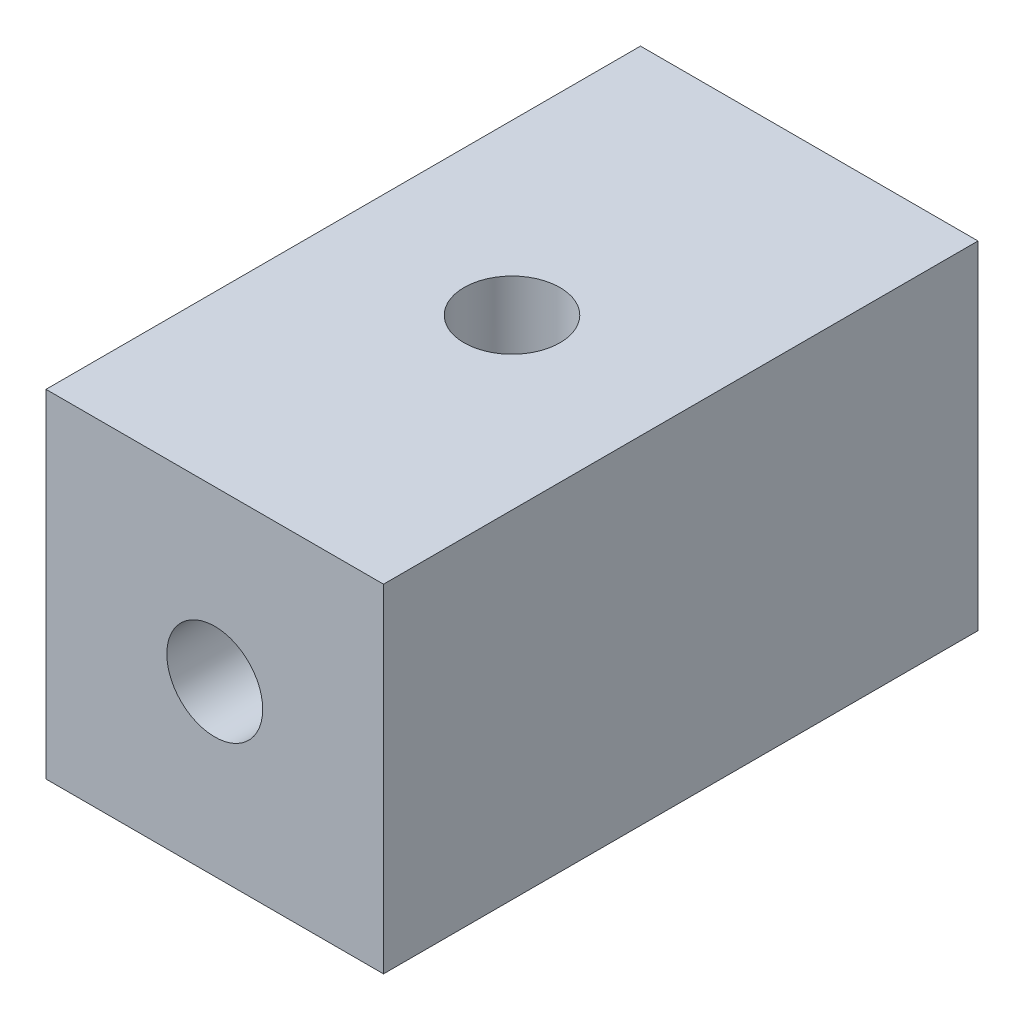
ISO-10303-21;
HEADER;
FILE_DESCRIPTION(('STEP AP214'),'2;1');
FILE_NAME('part.step','',(''),(''),'','','');
FILE_SCHEMA(('AUTOMOTIVE_DESIGN { 1 0 10303 214 1 1 1 1 }'));
ENDSEC;
DATA;
#1=APPLICATION_CONTEXT('core data for automotive mechanical design processes');
#2=APPLICATION_PROTOCOL_DEFINITION('international standard','automotive_design',2000,#1);
#3=PRODUCT_CONTEXT('',#1,'mechanical');
#4=PRODUCT('Part','Part','',(#3));
#5=PRODUCT_RELATED_PRODUCT_CATEGORY('part','',(#4));
#6=PRODUCT_DEFINITION_FORMATION('','',#4);
#7=PRODUCT_DEFINITION_CONTEXT('part definition',#1,'design');
#8=PRODUCT_DEFINITION('design','',#6,#7);
#9=PRODUCT_DEFINITION_SHAPE('','',#8);
#10=(LENGTH_UNIT() NAMED_UNIT(*) SI_UNIT(.MILLI.,.METRE.));
#11=(NAMED_UNIT(*) PLANE_ANGLE_UNIT() SI_UNIT($,.RADIAN.));
#12=(NAMED_UNIT(*) SI_UNIT($,.STERADIAN.) SOLID_ANGLE_UNIT());
#13=UNCERTAINTY_MEASURE_WITH_UNIT(LENGTH_MEASURE(1.E-05),#10,'distance_accuracy_value','');
#14=(GEOMETRIC_REPRESENTATION_CONTEXT(3) GLOBAL_UNCERTAINTY_ASSIGNED_CONTEXT((#13)) GLOBAL_UNIT_ASSIGNED_CONTEXT((#10,
#11,#12)) REPRESENTATION_CONTEXT('',''));
#15=CARTESIAN_POINT('',(0.,0.,0.));
#16=DIRECTION('',(0.,0.,1.));
#17=DIRECTION('',(1.,0.,0.));
#18=AXIS2_PLACEMENT_3D('',#15,#16,#17);
#19=CARTESIAN_POINT('',(0.,0.,39.37));
#20=DIRECTION('',(0.,0.,-1.));
#21=DIRECTION('',(-1.,0.,0.));
#22=AXIS2_PLACEMENT_3D('',#19,#20,#21);
#23=CYLINDRICAL_SURFACE('',#22,3.175);
#24=CARTESIAN_POINT('',(0.,0.,19.685));
#25=DIRECTION('',(0.,0.707106781186547,-0.707106781186547));
#26=DIRECTION('',(0.,-0.707106781186547,-0.707106781186547));
#27=AXIS2_PLACEMENT_3D('',#24,#25,#26);
#28=ELLIPSE('',#27,4.49012806053458,3.175);
#29=CARTESIAN_POINT('',(3.175,0.,19.685));
#30=VERTEX_POINT('',#29);
#31=CARTESIAN_POINT('',(-3.175,0.,19.685));
#32=VERTEX_POINT('',#31);
#33=EDGE_CURVE('E11',#30,#32,#28,.F.);
#34=ORIENTED_EDGE('',*,*,#33,.F.);
#35=CARTESIAN_POINT('',(0.,0.,19.685));
#36=DIRECTION('',(0.,-0.707106781186547,-0.707106781186547));
#37=DIRECTION('',(0.,0.707106781186547,-0.707106781186547));
#38=AXIS2_PLACEMENT_3D('',#35,#36,#37);
#39=ELLIPSE('',#38,4.49012806053458,3.175);
#40=EDGE_CURVE('E47',#32,#30,#39,.F.);
#41=ORIENTED_EDGE('',*,*,#40,.F.);
#42=EDGE_LOOP('',(#34,#41));
#43=FACE_BOUND('',#42,.T.);
#44=CARTESIAN_POINT('',(0.,0.,39.37));
#45=DIRECTION('',(0.,0.,1.));
#46=DIRECTION('',(1.,0.,0.));
#47=AXIS2_PLACEMENT_3D('',#44,#45,#46);
#48=CIRCLE('',#47,3.175);
#49=CARTESIAN_POINT('',(3.175,0.,39.37));
#50=VERTEX_POINT('',#49);
#51=EDGE_CURVE('E122',#50,#50,#48,.T.);
#52=ORIENTED_EDGE('',*,*,#51,.T.);
#53=EDGE_LOOP('',(#52));
#54=FACE_BOUND('',#53,.T.);
#55=ADVANCED_FACE('F33',(#43,#54),#23,.F.);
#56=CARTESIAN_POINT('',(0.,0.,39.37));
#57=DIRECTION('',(0.,0.,1.));
#58=DIRECTION('',(1.,0.,0.));
#59=AXIS2_PLACEMENT_3D('',#56,#57,#58);
#60=PLANE('',#59);
#61=DIRECTION('',(0.,1.,0.));
#62=VECTOR('',#61,1.);
#63=CARTESIAN_POINT('',(11.176,11.176,39.37));
#64=LINE('',#63,#62);
#65=CARTESIAN_POINT('',(11.176,-11.176,39.37));
#66=VERTEX_POINT('',#65);
#67=CARTESIAN_POINT('',(11.176,11.176,39.37));
#68=VERTEX_POINT('',#67);
#69=EDGE_CURVE('E114',#66,#68,#64,.T.);
#70=ORIENTED_EDGE('',*,*,#69,.T.);
#71=DIRECTION('',(-1.,0.,0.));
#72=VECTOR('',#71,1.);
#73=CARTESIAN_POINT('',(-11.176,11.176,39.37));
#74=LINE('',#73,#72);
#75=CARTESIAN_POINT('',(-11.176,11.176,39.37));
#76=VERTEX_POINT('',#75);
#77=EDGE_CURVE('E85',#68,#76,#74,.T.);
#78=ORIENTED_EDGE('',*,*,#77,.T.);
#79=DIRECTION('',(0.,-1.,0.));
#80=VECTOR('',#79,1.);
#81=CARTESIAN_POINT('',(-11.176,11.176,39.37));
#82=LINE('',#81,#80);
#83=CARTESIAN_POINT('',(-11.176,-11.176,39.37));
#84=VERTEX_POINT('',#83);
#85=EDGE_CURVE('E124',#76,#84,#82,.T.);
#86=ORIENTED_EDGE('',*,*,#85,.T.);
#87=DIRECTION('',(1.,0.,0.));
#88=VECTOR('',#87,1.);
#89=CARTESIAN_POINT('',(-11.176,-11.176,39.37));
#90=LINE('',#89,#88);
#91=EDGE_CURVE('E56',#84,#66,#90,.T.);
#92=ORIENTED_EDGE('',*,*,#91,.T.);
#93=EDGE_LOOP('',(#70,#78,#86,#92));
#94=FACE_BOUND('',#93,.T.);
#95=ORIENTED_EDGE('',*,*,#51,.F.);
#96=EDGE_LOOP('',(#95));
#97=FACE_BOUND('',#96,.T.);
#98=ADVANCED_FACE('F166',(#94,#97),#60,.T.);
#99=CARTESIAN_POINT('',(0.,0.,0.));
#100=DIRECTION('',(0.,0.,1.));
#101=DIRECTION('',(1.,0.,0.));
#102=AXIS2_PLACEMENT_3D('',#99,#100,#101);
#103=PLANE('',#102);
#104=DIRECTION('',(0.,1.,0.));
#105=VECTOR('',#104,1.);
#106=CARTESIAN_POINT('',(11.176,11.176,0.));
#107=LINE('',#106,#105);
#108=CARTESIAN_POINT('',(11.176,-11.176,0.));
#109=VERTEX_POINT('',#108);
#110=CARTESIAN_POINT('',(11.176,11.176,0.));
#111=VERTEX_POINT('',#110);
#112=EDGE_CURVE('E119',#109,#111,#107,.T.);
#113=ORIENTED_EDGE('',*,*,#112,.F.);
#114=DIRECTION('',(1.,0.,0.));
#115=VECTOR('',#114,1.);
#116=CARTESIAN_POINT('',(-11.176,-11.176,0.));
#117=LINE('',#116,#115);
#118=CARTESIAN_POINT('',(-11.176,-11.176,0.));
#119=VERTEX_POINT('',#118);
#120=EDGE_CURVE('E77',#119,#109,#117,.T.);
#121=ORIENTED_EDGE('',*,*,#120,.F.);
#122=DIRECTION('',(0.,-1.,0.));
#123=VECTOR('',#122,1.);
#124=CARTESIAN_POINT('',(-11.176,11.176,0.));
#125=LINE('',#124,#123);
#126=CARTESIAN_POINT('',(-11.176,11.176,0.));
#127=VERTEX_POINT('',#126);
#128=EDGE_CURVE('E115',#127,#119,#125,.T.);
#129=ORIENTED_EDGE('',*,*,#128,.F.);
#130=DIRECTION('',(-1.,0.,0.));
#131=VECTOR('',#130,1.);
#132=CARTESIAN_POINT('',(-11.176,11.176,0.));
#133=LINE('',#132,#131);
#134=EDGE_CURVE('E117',#111,#127,#133,.T.);
#135=ORIENTED_EDGE('',*,*,#134,.F.);
#136=EDGE_LOOP('',(#113,#121,#129,#135));
#137=FACE_BOUND('',#136,.T.);
#138=CARTESIAN_POINT('',(0.,0.,0.));
#139=DIRECTION('',(0.,0.,1.));
#140=DIRECTION('',(1.,0.,0.));
#141=AXIS2_PLACEMENT_3D('',#138,#139,#140);
#142=CIRCLE('',#141,3.175);
#143=CARTESIAN_POINT('',(3.175,0.,0.));
#144=VERTEX_POINT('',#143);
#145=EDGE_CURVE('E128',#144,#144,#142,.T.);
#146=ORIENTED_EDGE('',*,*,#145,.T.);
#147=EDGE_LOOP('',(#146));
#148=FACE_BOUND('',#147,.T.);
#149=ADVANCED_FACE('F150',(#137,#148),#103,.F.);
#150=CARTESIAN_POINT('',(11.176,11.176,39.37));
#151=DIRECTION('',(-1.,0.,0.));
#152=DIRECTION('',(0.,-1.,0.));
#153=AXIS2_PLACEMENT_3D('',#150,#151,#152);
#154=PLANE('',#153);
#155=ORIENTED_EDGE('',*,*,#112,.T.);
#156=DIRECTION('',(0.,0.,-1.));
#157=VECTOR('',#156,1.);
#158=CARTESIAN_POINT('',(11.176,11.176,39.37));
#159=LINE('',#158,#157);
#160=EDGE_CURVE('E99',#68,#111,#159,.T.);
#161=ORIENTED_EDGE('',*,*,#160,.F.);
#162=ORIENTED_EDGE('',*,*,#69,.F.);
#163=DIRECTION('',(0.,0.,-1.));
#164=VECTOR('',#163,1.);
#165=CARTESIAN_POINT('',(11.176,-11.176,39.37));
#166=LINE('',#165,#164);
#167=EDGE_CURVE('E111',#66,#109,#166,.T.);
#168=ORIENTED_EDGE('',*,*,#167,.T.);
#169=EDGE_LOOP('',(#155,#161,#162,#168));
#170=FACE_BOUND('',#169,.T.);
#171=ADVANCED_FACE('F35',(#170),#154,.F.);
#172=CARTESIAN_POINT('',(-11.176,11.176,39.37));
#173=DIRECTION('',(0.,-1.,0.));
#174=DIRECTION('',(0.,0.,-1.));
#175=AXIS2_PLACEMENT_3D('',#172,#173,#174);
#176=PLANE('',#175);
#177=CARTESIAN_POINT('',(0.,11.176,19.685));
#178=DIRECTION('',(0.,1.,0.));
#179=DIRECTION('',(0.,0.,1.));
#180=AXIS2_PLACEMENT_3D('',#177,#178,#179);
#181=CIRCLE('',#180,3.175);
#182=CARTESIAN_POINT('',(0.,11.176,22.86));
#183=VERTEX_POINT('',#182);
#184=EDGE_CURVE('E136',#183,#183,#181,.T.);
#185=ORIENTED_EDGE('',*,*,#184,.F.);
#186=EDGE_LOOP('',(#185));
#187=FACE_BOUND('',#186,.T.);
#188=ORIENTED_EDGE('',*,*,#134,.T.);
#189=DIRECTION('',(0.,0.,-1.));
#190=VECTOR('',#189,1.);
#191=CARTESIAN_POINT('',(-11.176,11.176,39.37));
#192=LINE('',#191,#190);
#193=EDGE_CURVE('E106',#76,#127,#192,.T.);
#194=ORIENTED_EDGE('',*,*,#193,.F.);
#195=ORIENTED_EDGE('',*,*,#77,.F.);
#196=ORIENTED_EDGE('',*,*,#160,.T.);
#197=EDGE_LOOP('',(#188,#194,#195,#196));
#198=FACE_BOUND('',#197,.T.);
#199=ADVANCED_FACE('F140',(#187,#198),#176,.F.);
#200=CARTESIAN_POINT('',(-11.176,11.176,39.37));
#201=DIRECTION('',(1.,0.,0.));
#202=DIRECTION('',(0.,1.,0.));
#203=AXIS2_PLACEMENT_3D('',#200,#201,#202);
#204=PLANE('',#203);
#205=ORIENTED_EDGE('',*,*,#128,.T.);
#206=DIRECTION('',(0.,0.,-1.));
#207=VECTOR('',#206,1.);
#208=CARTESIAN_POINT('',(-11.176,-11.176,39.37));
#209=LINE('',#208,#207);
#210=EDGE_CURVE('E109',#84,#119,#209,.T.);
#211=ORIENTED_EDGE('',*,*,#210,.F.);
#212=ORIENTED_EDGE('',*,*,#85,.F.);
#213=ORIENTED_EDGE('',*,*,#193,.T.);
#214=EDGE_LOOP('',(#205,#211,#212,#213));
#215=FACE_BOUND('',#214,.T.);
#216=ADVANCED_FACE('F142',(#215),#204,.F.);
#217=CARTESIAN_POINT('',(-11.176,-11.176,39.37));
#218=DIRECTION('',(0.,1.,0.));
#219=DIRECTION('',(0.,0.,1.));
#220=AXIS2_PLACEMENT_3D('',#217,#218,#219);
#221=PLANE('',#220);
#222=CARTESIAN_POINT('',(0.,-11.176,19.685));
#223=DIRECTION('',(0.,1.,0.));
#224=DIRECTION('',(0.,0.,1.));
#225=AXIS2_PLACEMENT_3D('',#222,#223,#224);
#226=CIRCLE('',#225,3.175);
#227=CARTESIAN_POINT('',(0.,-11.176,22.86));
#228=VERTEX_POINT('',#227);
#229=EDGE_CURVE('E131',#228,#228,#226,.T.);
#230=ORIENTED_EDGE('',*,*,#229,.T.);
#231=EDGE_LOOP('',(#230));
#232=FACE_BOUND('',#231,.T.);
#233=ORIENTED_EDGE('',*,*,#120,.T.);
#234=ORIENTED_EDGE('',*,*,#167,.F.);
#235=ORIENTED_EDGE('',*,*,#91,.F.);
#236=ORIENTED_EDGE('',*,*,#210,.T.);
#237=EDGE_LOOP('',(#233,#234,#235,#236));
#238=FACE_BOUND('',#237,.T.);
#239=ADVANCED_FACE('F154',(#232,#238),#221,.F.);
#240=CARTESIAN_POINT('',(0.,0.,19.685));
#241=DIRECTION('',(0.,0.707106781186547,-0.707106781186547));
#242=DIRECTION('',(0.,-0.707106781186547,-0.707106781186547));
#243=AXIS2_PLACEMENT_3D('',#240,#241,#242);
#244=ELLIPSE('',#243,4.49012806053458,3.175);
#245=EDGE_CURVE('E41',#30,#32,#244,.T.);
#246=ORIENTED_EDGE('',*,*,#245,.F.);
#247=CARTESIAN_POINT('',(0.,0.,19.685));
#248=DIRECTION('',(0.,-0.707106781186547,-0.707106781186547));
#249=DIRECTION('',(0.,0.707106781186547,-0.707106781186547));
#250=AXIS2_PLACEMENT_3D('',#247,#248,#249);
#251=ELLIPSE('',#250,4.49012806053458,3.175);
#252=EDGE_CURVE('E90',#32,#30,#251,.T.);
#253=ORIENTED_EDGE('',*,*,#252,.F.);
#254=EDGE_LOOP('',(#246,#253));
#255=FACE_BOUND('',#254,.T.);
#256=ORIENTED_EDGE('',*,*,#145,.F.);
#257=EDGE_LOOP('',(#256));
#258=FACE_BOUND('',#257,.T.);
#259=ADVANCED_FACE('F102',(#255,#258),#23,.F.);
#260=CARTESIAN_POINT('',(0.,-14.224,19.685));
#261=DIRECTION('',(0.,1.,0.));
#262=DIRECTION('',(0.,0.,1.));
#263=AXIS2_PLACEMENT_3D('',#260,#261,#262);
#264=CYLINDRICAL_SURFACE('',#263,3.175);
#265=ORIENTED_EDGE('',*,*,#245,.T.);
#266=ORIENTED_EDGE('',*,*,#40,.T.);
#267=EDGE_LOOP('',(#265,#266));
#268=FACE_BOUND('',#267,.T.);
#269=ORIENTED_EDGE('',*,*,#229,.F.);
#270=EDGE_LOOP('',(#269));
#271=FACE_BOUND('',#270,.T.);
#272=ADVANCED_FACE('F97',(#268,#271),#264,.F.);
#273=ORIENTED_EDGE('',*,*,#33,.T.);
#274=ORIENTED_EDGE('',*,*,#252,.T.);
#275=EDGE_LOOP('',(#273,#274));
#276=FACE_BOUND('',#275,.T.);
#277=ORIENTED_EDGE('',*,*,#184,.T.);
#278=EDGE_LOOP('',(#277));
#279=FACE_BOUND('',#278,.T.);
#280=ADVANCED_FACE('F91',(#276,#279),#264,.F.);
#281=CLOSED_SHELL('',(#55,#98,#149,#171,#199,#216,#239,#259,#272,#280));
#282=MANIFOLD_SOLID_BREP('B2',#281);
#283=ADVANCED_BREP_SHAPE_REPRESENTATION('',(#18,#282),#14);
#284=SHAPE_DEFINITION_REPRESENTATION(#9,#283);
ENDSEC;
END-ISO-10303-21;
